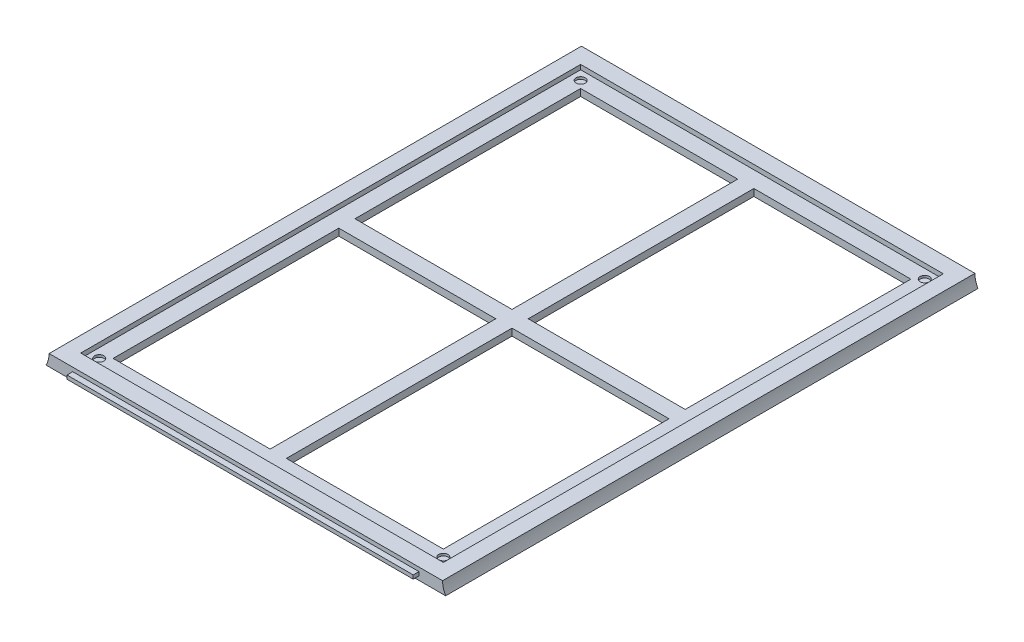
ISO-10303-21;
HEADER;
FILE_DESCRIPTION(('STEP AP214'),'2;1');
FILE_NAME('part.step','',(''),(''),'','','');
FILE_SCHEMA(('AUTOMOTIVE_DESIGN { 1 0 10303 214 1 1 1 1 }'));
ENDSEC;
DATA;
#1=APPLICATION_CONTEXT('core data for automotive mechanical design processes');
#2=APPLICATION_PROTOCOL_DEFINITION('international standard','automotive_design',2000,#1);
#3=PRODUCT_CONTEXT('',#1,'mechanical');
#4=PRODUCT('Part','Part','',(#3));
#5=PRODUCT_RELATED_PRODUCT_CATEGORY('part','',(#4));
#6=PRODUCT_DEFINITION_FORMATION('','',#4);
#7=PRODUCT_DEFINITION_CONTEXT('part definition',#1,'design');
#8=PRODUCT_DEFINITION('design','',#6,#7);
#9=PRODUCT_DEFINITION_SHAPE('','',#8);
#10=(LENGTH_UNIT() NAMED_UNIT(*) SI_UNIT(.MILLI.,.METRE.));
#11=(NAMED_UNIT(*) PLANE_ANGLE_UNIT() SI_UNIT($,.RADIAN.));
#12=(NAMED_UNIT(*) SI_UNIT($,.STERADIAN.) SOLID_ANGLE_UNIT());
#13=UNCERTAINTY_MEASURE_WITH_UNIT(LENGTH_MEASURE(1.E-05),#10,'distance_accuracy_value','');
#14=(GEOMETRIC_REPRESENTATION_CONTEXT(3) GLOBAL_UNCERTAINTY_ASSIGNED_CONTEXT((#13)) GLOBAL_UNIT_ASSIGNED_CONTEXT((#10,
#11,#12)) REPRESENTATION_CONTEXT('',''));
#15=CARTESIAN_POINT('',(0.,0.,0.));
#16=DIRECTION('',(0.,0.,1.));
#17=DIRECTION('',(1.,0.,0.));
#18=AXIS2_PLACEMENT_3D('',#15,#16,#17);
#19=CARTESIAN_POINT('',(0.,2.74600749765697,0.));
#20=DIRECTION('',(0.,-1.,0.));
#21=DIRECTION('',(0.,0.,-1.));
#22=AXIS2_PLACEMENT_3D('',#19,#20,#21);
#23=PLANE('',#22);
#24=CARTESIAN_POINT('',(1.31440487347712,2.74600749765697,219.));
#25=DIRECTION('',(0.,1.,0.));
#26=DIRECTION('',(0.,0.,1.));
#27=AXIS2_PLACEMENT_3D('',#24,#25,#26);
#28=CIRCLE('',#27,2.);
#29=CARTESIAN_POINT('',(1.31440487347712,2.74600749765697,221.));
#30=VERTEX_POINT('',#29);
#31=EDGE_CURVE('E666',#30,#30,#28,.T.);
#32=ORIENTED_EDGE('',*,*,#31,.F.);
#33=EDGE_LOOP('',(#32));
#34=FACE_BOUND('',#33,.T.);
#35=CARTESIAN_POINT('',(-147.365595126523,2.74600749765697,11.));
#36=DIRECTION('',(0.,1.,0.));
#37=DIRECTION('',(0.,0.,1.));
#38=AXIS2_PLACEMENT_3D('',#35,#36,#37);
#39=CIRCLE('',#38,2.);
#40=CARTESIAN_POINT('',(-147.365595126523,2.74600749765697,13.));
#41=VERTEX_POINT('',#40);
#42=EDGE_CURVE('E662',#41,#41,#39,.T.);
#43=ORIENTED_EDGE('',*,*,#42,.F.);
#44=EDGE_LOOP('',(#43));
#45=FACE_BOUND('',#44,.T.);
#46=CARTESIAN_POINT('',(1.31440487347709,2.74600749765697,11.));
#47=DIRECTION('',(0.,1.,0.));
#48=DIRECTION('',(0.,0.,1.));
#49=AXIS2_PLACEMENT_3D('',#46,#47,#48);
#50=CIRCLE('',#49,2.);
#51=CARTESIAN_POINT('',(1.31440487347709,2.74600749765697,13.));
#52=VERTEX_POINT('',#51);
#53=EDGE_CURVE('E657',#52,#52,#50,.T.);
#54=ORIENTED_EDGE('',*,*,#53,.F.);
#55=EDGE_LOOP('',(#54));
#56=FACE_BOUND('',#55,.T.);
#57=CARTESIAN_POINT('',(-147.365595126523,2.74600749765697,219.));
#58=DIRECTION('',(0.,1.,0.));
#59=DIRECTION('',(0.,0.,1.));
#60=AXIS2_PLACEMENT_3D('',#57,#58,#59);
#61=CIRCLE('',#60,2.);
#62=CARTESIAN_POINT('',(-147.365595126523,2.74600749765697,221.));
#63=VERTEX_POINT('',#62);
#64=EDGE_CURVE('E669',#63,#63,#61,.T.);
#65=ORIENTED_EDGE('',*,*,#64,.F.);
#66=EDGE_LOOP('',(#65));
#67=FACE_BOUND('',#66,.T.);
#68=DIRECTION('',(0.,0.,1.));
#69=VECTOR('',#68,1.);
#70=CARTESIAN_POINT('',(5.31440487347708,2.74600749765697,223.));
#71=LINE('',#70,#69);
#72=CARTESIAN_POINT('',(5.3144048734771,2.74600749765697,7.00000000000003));
#73=VERTEX_POINT('',#72);
#74=CARTESIAN_POINT('',(5.31440487347708,2.74600749765697,223.));
#75=VERTEX_POINT('',#74);
#76=EDGE_CURVE('E349',#73,#75,#71,.T.);
#77=ORIENTED_EDGE('',*,*,#76,.F.);
#78=DIRECTION('',(1.,0.,0.));
#79=VECTOR('',#78,1.);
#80=CARTESIAN_POINT('',(-151.365595126523,2.74600749765697,7.00000000000003));
#81=LINE('',#80,#79);
#82=CARTESIAN_POINT('',(-151.365595126523,2.74600749765697,7.00000000000003));
#83=VERTEX_POINT('',#82);
#84=EDGE_CURVE('E357',#83,#73,#81,.T.);
#85=ORIENTED_EDGE('',*,*,#84,.F.);
#86=DIRECTION('',(0.,0.,-1.));
#87=VECTOR('',#86,1.);
#88=CARTESIAN_POINT('',(-151.365595126523,2.74600749765697,223.));
#89=LINE('',#88,#87);
#90=CARTESIAN_POINT('',(-151.365595126523,2.74600749765697,223.));
#91=VERTEX_POINT('',#90);
#92=EDGE_CURVE('E355',#91,#83,#89,.T.);
#93=ORIENTED_EDGE('',*,*,#92,.F.);
#94=DIRECTION('',(-1.,0.,0.));
#95=VECTOR('',#94,1.);
#96=CARTESIAN_POINT('',(-151.365595126523,2.74600749765697,223.));
#97=LINE('',#96,#95);
#98=EDGE_CURVE('E352',#75,#91,#97,.T.);
#99=ORIENTED_EDGE('',*,*,#98,.F.);
#100=EDGE_LOOP('',(#77,#85,#93,#99));
#101=FACE_BOUND('',#100,.T.);
#102=DIRECTION('',(1.,0.,0.));
#103=VECTOR('',#102,1.);
#104=CARTESIAN_POINT('',(-144.365595126523,2.74600749765697,111.5));
#105=LINE('',#104,#103);
#106=CARTESIAN_POINT('',(-144.365595126523,2.74600749765697,111.5));
#107=VERTEX_POINT('',#106);
#108=CARTESIAN_POINT('',(-76.525595126523,2.74600749765697,111.5));
#109=VERTEX_POINT('',#108);
#110=EDGE_CURVE('E297',#107,#109,#105,.T.);
#111=ORIENTED_EDGE('',*,*,#110,.F.);
#112=DIRECTION('',(0.,0.,1.));
#113=VECTOR('',#112,1.);
#114=CARTESIAN_POINT('',(-144.365595126523,2.74600749765697,14.));
#115=LINE('',#114,#113);
#116=CARTESIAN_POINT('',(-144.365595126523,2.74600749765697,14.));
#117=VERTEX_POINT('',#116);
#118=EDGE_CURVE('E281',#117,#107,#115,.T.);
#119=ORIENTED_EDGE('',*,*,#118,.F.);
#120=DIRECTION('',(-1.,0.,0.));
#121=VECTOR('',#120,1.);
#122=CARTESIAN_POINT('',(-144.365595126523,2.74600749765697,14.));
#123=LINE('',#122,#121);
#124=CARTESIAN_POINT('',(-76.525595126523,2.74600749765697,14.));
#125=VERTEX_POINT('',#124);
#126=EDGE_CURVE('E303',#125,#117,#123,.T.);
#127=ORIENTED_EDGE('',*,*,#126,.F.);
#128=DIRECTION('',(0.,0.,-1.));
#129=VECTOR('',#128,1.);
#130=CARTESIAN_POINT('',(-76.525595126523,2.74600749765697,14.));
#131=LINE('',#130,#129);
#132=EDGE_CURVE('E300',#109,#125,#131,.T.);
#133=ORIENTED_EDGE('',*,*,#132,.F.);
#134=EDGE_LOOP('',(#111,#119,#127,#133));
#135=FACE_BOUND('',#134,.T.);
#136=DIRECTION('',(-1.,0.,0.));
#137=VECTOR('',#136,1.);
#138=CARTESIAN_POINT('',(-1.685595126523,2.74600749765697,118.5));
#139=LINE('',#138,#137);
#140=CARTESIAN_POINT('',(-1.685595126523,2.74600749765697,118.5));
#141=VERTEX_POINT('',#140);
#142=CARTESIAN_POINT('',(-69.525595126523,2.74600749765697,118.5));
#143=VERTEX_POINT('',#142);
#144=EDGE_CURVE('E254',#141,#143,#139,.T.);
#145=ORIENTED_EDGE('',*,*,#144,.F.);
#146=DIRECTION('',(0.,0.,-1.));
#147=VECTOR('',#146,1.);
#148=CARTESIAN_POINT('',(-1.685595126523,2.74600749765697,118.5));
#149=LINE('',#148,#147);
#150=CARTESIAN_POINT('',(-1.685595126523,2.74600749765697,216.));
#151=VERTEX_POINT('',#150);
#152=EDGE_CURVE('E232',#151,#141,#149,.T.);
#153=ORIENTED_EDGE('',*,*,#152,.F.);
#154=DIRECTION('',(1.,0.,0.));
#155=VECTOR('',#154,1.);
#156=CARTESIAN_POINT('',(-1.685595126523,2.74600749765697,216.));
#157=LINE('',#156,#155);
#158=CARTESIAN_POINT('',(-69.525595126523,2.74600749765697,216.));
#159=VERTEX_POINT('',#158);
#160=EDGE_CURVE('E242',#159,#151,#157,.T.);
#161=ORIENTED_EDGE('',*,*,#160,.F.);
#162=DIRECTION('',(0.,0.,1.));
#163=VECTOR('',#162,1.);
#164=CARTESIAN_POINT('',(-69.525595126523,2.74600749765697,118.5));
#165=LINE('',#164,#163);
#166=EDGE_CURVE('E248',#143,#159,#165,.T.);
#167=ORIENTED_EDGE('',*,*,#166,.F.);
#168=EDGE_LOOP('',(#145,#153,#161,#167));
#169=FACE_BOUND('',#168,.T.);
#170=DIRECTION('',(1.,0.,0.));
#171=VECTOR('',#170,1.);
#172=CARTESIAN_POINT('',(-144.365595126523,2.74600749765697,216.));
#173=LINE('',#172,#171);
#174=CARTESIAN_POINT('',(-144.365595126523,2.74600749765697,216.));
#175=VERTEX_POINT('',#174);
#176=CARTESIAN_POINT('',(-76.525595126523,2.74600749765697,216.));
#177=VERTEX_POINT('',#176);
#178=EDGE_CURVE('E293',#175,#177,#173,.T.);
#179=ORIENTED_EDGE('',*,*,#178,.F.);
#180=DIRECTION('',(0.,0.,1.));
#181=VECTOR('',#180,1.);
#182=CARTESIAN_POINT('',(-144.365595126523,2.74600749765697,118.5));
#183=LINE('',#182,#181);
#184=CARTESIAN_POINT('',(-144.365595126523,2.74600749765697,118.5));
#185=VERTEX_POINT('',#184);
#186=EDGE_CURVE('E271',#185,#175,#183,.T.);
#187=ORIENTED_EDGE('',*,*,#186,.F.);
#188=DIRECTION('',(-1.,0.,0.));
#189=VECTOR('',#188,1.);
#190=CARTESIAN_POINT('',(-144.365595126523,2.74600749765697,118.5));
#191=LINE('',#190,#189);
#192=CARTESIAN_POINT('',(-76.525595126523,2.74600749765697,118.5));
#193=VERTEX_POINT('',#192);
#194=EDGE_CURVE('E285',#193,#185,#191,.T.);
#195=ORIENTED_EDGE('',*,*,#194,.F.);
#196=DIRECTION('',(0.,0.,-1.));
#197=VECTOR('',#196,1.);
#198=CARTESIAN_POINT('',(-76.525595126523,2.74600749765697,118.5));
#199=LINE('',#198,#197);
#200=EDGE_CURVE('E290',#177,#193,#199,.T.);
#201=ORIENTED_EDGE('',*,*,#200,.F.);
#202=EDGE_LOOP('',(#179,#187,#195,#201));
#203=FACE_BOUND('',#202,.T.);
#204=DIRECTION('',(0.,0.,1.));
#205=VECTOR('',#204,1.);
#206=CARTESIAN_POINT('',(-69.525595126523,2.74600749765697,14.));
#207=LINE('',#206,#205);
#208=CARTESIAN_POINT('',(-69.525595126523,2.74600749765697,14.));
#209=VERTEX_POINT('',#208);
#210=CARTESIAN_POINT('',(-69.525595126523,2.74600749765697,111.5));
#211=VERTEX_POINT('',#210);
#212=EDGE_CURVE('E278',#209,#211,#207,.T.);
#213=ORIENTED_EDGE('',*,*,#212,.F.);
#214=DIRECTION('',(-1.,0.,0.));
#215=VECTOR('',#214,1.);
#216=CARTESIAN_POINT('',(-69.525595126523,2.74600749765697,14.));
#217=LINE('',#216,#215);
#218=CARTESIAN_POINT('',(-1.685595126523,2.74600749765697,14.));
#219=VERTEX_POINT('',#218);
#220=EDGE_CURVE('E264',#219,#209,#217,.T.);
#221=ORIENTED_EDGE('',*,*,#220,.F.);
#222=DIRECTION('',(0.,0.,-1.));
#223=VECTOR('',#222,1.);
#224=CARTESIAN_POINT('',(-1.685595126523,2.74600749765697,14.));
#225=LINE('',#224,#223);
#226=CARTESIAN_POINT('',(-1.685595126523,2.74600749765697,111.5));
#227=VERTEX_POINT('',#226);
#228=EDGE_CURVE('E274',#227,#219,#225,.T.);
#229=ORIENTED_EDGE('',*,*,#228,.F.);
#230=DIRECTION('',(1.,0.,0.));
#231=VECTOR('',#230,1.);
#232=CARTESIAN_POINT('',(-69.525595126523,2.74600749765697,111.5));
#233=LINE('',#232,#231);
#234=EDGE_CURVE('E276',#211,#227,#233,.T.);
#235=ORIENTED_EDGE('',*,*,#234,.F.);
#236=EDGE_LOOP('',(#213,#221,#229,#235));
#237=FACE_BOUND('',#236,.T.);
#238=ADVANCED_FACE('F43',(#34,#45,#56,#67,#101,#135,#169,#203,#237),#23,.F.);
#239=CARTESIAN_POINT('',(-158.025595126523,4.74600749765697,230.));
#240=DIRECTION('',(0.,-1.,0.));
#241=DIRECTION('',(0.,0.,-1.));
#242=AXIS2_PLACEMENT_3D('',#239,#240,#241);
#243=PLANE('',#242);
#244=DIRECTION('',(-1.,0.,0.));
#245=VECTOR('',#244,1.);
#246=CARTESIAN_POINT('',(-158.025595126523,4.74600749765697,0.));
#247=LINE('',#246,#245);
#248=CARTESIAN_POINT('',(11.974404873477,4.74600749765697,0.));
#249=VERTEX_POINT('',#248);
#250=CARTESIAN_POINT('',(-158.025595126523,4.74600749765697,0.));
#251=VERTEX_POINT('',#250);
#252=EDGE_CURVE('E422',#249,#251,#247,.T.);
#253=ORIENTED_EDGE('',*,*,#252,.T.);
#254=DIRECTION('',(0.,0.,-1.));
#255=VECTOR('',#254,1.);
#256=CARTESIAN_POINT('',(-158.025595126523,4.74600749765697,230.));
#257=LINE('',#256,#255);
#258=CARTESIAN_POINT('',(-158.025595126523,4.74600749765697,230.));
#259=VERTEX_POINT('',#258);
#260=EDGE_CURVE('E432',#259,#251,#257,.T.);
#261=ORIENTED_EDGE('',*,*,#260,.F.);
#262=DIRECTION('',(-1.,0.,0.));
#263=VECTOR('',#262,1.);
#264=CARTESIAN_POINT('',(-158.025595126523,4.74600749765697,230.));
#265=LINE('',#264,#263);
#266=CARTESIAN_POINT('',(11.974404873477,4.74600749765697,230.));
#267=VERTEX_POINT('',#266);
#268=EDGE_CURVE('E412',#267,#259,#265,.T.);
#269=ORIENTED_EDGE('',*,*,#268,.F.);
#270=DIRECTION('',(0.,0.,-1.));
#271=VECTOR('',#270,1.);
#272=CARTESIAN_POINT('',(11.974404873477,4.74600749765697,230.));
#273=LINE('',#272,#271);
#274=EDGE_CURVE('E435',#267,#249,#273,.T.);
#275=ORIENTED_EDGE('',*,*,#274,.T.);
#276=EDGE_LOOP('',(#253,#261,#269,#275));
#277=FACE_BOUND('',#276,.T.);
#278=DIRECTION('',(0.,0.,1.));
#279=VECTOR('',#278,1.);
#280=CARTESIAN_POINT('',(5.31440487347708,4.74600749765697,223.));
#281=LINE('',#280,#279);
#282=CARTESIAN_POINT('',(5.31440487347709,4.74600749765697,7.00000000000003));
#283=VERTEX_POINT('',#282);
#284=CARTESIAN_POINT('',(5.31440487347708,4.74600749765697,223.));
#285=VERTEX_POINT('',#284);
#286=EDGE_CURVE('E348',#283,#285,#281,.T.);
#287=ORIENTED_EDGE('',*,*,#286,.T.);
#288=DIRECTION('',(-1.,0.,0.));
#289=VECTOR('',#288,1.);
#290=CARTESIAN_POINT('',(-151.365595126523,4.74600749765697,223.));
#291=LINE('',#290,#289);
#292=CARTESIAN_POINT('',(-151.365595126523,4.74600749765697,223.));
#293=VERTEX_POINT('',#292);
#294=EDGE_CURVE('E362',#285,#293,#291,.T.);
#295=ORIENTED_EDGE('',*,*,#294,.T.);
#296=DIRECTION('',(0.,0.,-1.));
#297=VECTOR('',#296,1.);
#298=CARTESIAN_POINT('',(-151.365595126523,4.74600749765697,223.));
#299=LINE('',#298,#297);
#300=CARTESIAN_POINT('',(-151.365595126523,4.74600749765697,7.00000000000003));
#301=VERTEX_POINT('',#300);
#302=EDGE_CURVE('E365',#293,#301,#299,.T.);
#303=ORIENTED_EDGE('',*,*,#302,.T.);
#304=DIRECTION('',(1.,0.,0.));
#305=VECTOR('',#304,1.);
#306=CARTESIAN_POINT('',(-151.365595126523,4.74600749765697,7.00000000000003));
#307=LINE('',#306,#305);
#308=EDGE_CURVE('E353',#301,#283,#307,.T.);
#309=ORIENTED_EDGE('',*,*,#308,.T.);
#310=EDGE_LOOP('',(#287,#295,#303,#309));
#311=FACE_BOUND('',#310,.T.);
#312=ADVANCED_FACE('F475',(#277,#311),#243,.F.);
#313=CARTESIAN_POINT('',(21.9744048734771,4.746007497657,230.));
#314=DIRECTION('',(0.,0.,1.));
#315=DIRECTION('',(1.,0.,0.));
#316=AXIS2_PLACEMENT_3D('',#313,#314,#315);
#317=PLANE('',#316);
#318=CARTESIAN_POINT('',(21.9744048734771,4.746007497657,230.));
#319=DIRECTION('',(0.,0.,-1.));
#320=DIRECTION('',(1.,0.,0.));
#321=AXIS2_PLACEMENT_3D('',#318,#319,#320);
#322=CIRCLE('',#321,10.0000000000001);
#323=CARTESIAN_POINT('',(13.3141508356327,-0.253992502343023,230.));
#324=VERTEX_POINT('',#323);
#325=EDGE_CURVE('E409',#324,#267,#322,.T.);
#326=ORIENTED_EDGE('',*,*,#325,.T.);
#327=ORIENTED_EDGE('',*,*,#268,.T.);
#328=CARTESIAN_POINT('',(-168.025595126523,4.74600749765706,230.));
#329=DIRECTION('',(0.,0.,-1.));
#330=DIRECTION('',(-1.,0.,0.));
#331=AXIS2_PLACEMENT_3D('',#328,#329,#330);
#332=CIRCLE('',#331,10.0000000000003);
#333=CARTESIAN_POINT('',(-159.365341088679,-0.253992502343008,230.));
#334=VERTEX_POINT('',#333);
#335=EDGE_CURVE('E415',#259,#334,#332,.T.);
#336=ORIENTED_EDGE('',*,*,#335,.T.);
#337=DIRECTION('',(1.,0.,0.));
#338=VECTOR('',#337,1.);
#339=CARTESIAN_POINT('',(13.3141508356327,-0.253992502343023,230.));
#340=LINE('',#339,#338);
#341=EDGE_CURVE('E417',#334,#324,#340,.T.);
#342=ORIENTED_EDGE('',*,*,#341,.T.);
#343=EDGE_LOOP('',(#326,#327,#336,#342));
#344=FACE_BOUND('',#343,.T.);
#345=DIRECTION('',(1.,0.,0.));
#346=VECTOR('',#345,1.);
#347=CARTESIAN_POINT('',(-147.825595126523,1.44600749765696,230.));
#348=LINE('',#347,#346);
#349=CARTESIAN_POINT('',(-147.825595126523,1.44600749765696,230.));
#350=VERTEX_POINT('',#349);
#351=CARTESIAN_POINT('',(1.77440487347696,1.44600749765696,230.));
#352=VERTEX_POINT('',#351);
#353=EDGE_CURVE('E393',#350,#352,#348,.T.);
#354=ORIENTED_EDGE('',*,*,#353,.F.);
#355=DIRECTION('',(0.,-1.,0.));
#356=VECTOR('',#355,1.);
#357=CARTESIAN_POINT('',(-147.825595126523,3.04600749765697,230.));
#358=LINE('',#357,#356);
#359=CARTESIAN_POINT('',(-147.825595126523,3.04600749765697,230.));
#360=VERTEX_POINT('',#359);
#361=EDGE_CURVE('E379',#360,#350,#358,.T.);
#362=ORIENTED_EDGE('',*,*,#361,.F.);
#363=DIRECTION('',(-1.,0.,0.));
#364=VECTOR('',#363,1.);
#365=CARTESIAN_POINT('',(-147.825595126523,3.04600749765697,230.));
#366=LINE('',#365,#364);
#367=CARTESIAN_POINT('',(1.77440487347696,3.04600749765697,230.));
#368=VERTEX_POINT('',#367);
#369=EDGE_CURVE('E384',#368,#360,#366,.T.);
#370=ORIENTED_EDGE('',*,*,#369,.F.);
#371=DIRECTION('',(0.,1.,0.));
#372=VECTOR('',#371,1.);
#373=CARTESIAN_POINT('',(1.77440487347696,3.04600749765697,230.));
#374=LINE('',#373,#372);
#375=EDGE_CURVE('E395',#352,#368,#374,.T.);
#376=ORIENTED_EDGE('',*,*,#375,.F.);
#377=EDGE_LOOP('',(#354,#362,#370,#376));
#378=FACE_BOUND('',#377,.T.);
#379=ADVANCED_FACE('F481',(#344,#378),#317,.T.);
#380=CARTESIAN_POINT('',(21.9744048734771,4.746007497657,0.));
#381=DIRECTION('',(0.,0.,1.));
#382=DIRECTION('',(1.,0.,0.));
#383=AXIS2_PLACEMENT_3D('',#380,#381,#382);
#384=PLANE('',#383);
#385=CARTESIAN_POINT('',(21.9744048734771,4.746007497657,0.));
#386=DIRECTION('',(0.,0.,-1.));
#387=DIRECTION('',(1.,0.,0.));
#388=AXIS2_PLACEMENT_3D('',#385,#386,#387);
#389=CIRCLE('',#388,10.0000000000001);
#390=CARTESIAN_POINT('',(13.3141508356327,-0.253992502343023,0.));
#391=VERTEX_POINT('',#390);
#392=EDGE_CURVE('E408',#391,#249,#389,.T.);
#393=ORIENTED_EDGE('',*,*,#392,.F.);
#394=DIRECTION('',(1.,0.,0.));
#395=VECTOR('',#394,1.);
#396=CARTESIAN_POINT('',(13.3141508356327,-0.253992502343023,0.));
#397=LINE('',#396,#395);
#398=CARTESIAN_POINT('',(-159.365341088679,-0.253992502343008,0.));
#399=VERTEX_POINT('',#398);
#400=EDGE_CURVE('E413',#399,#391,#397,.T.);
#401=ORIENTED_EDGE('',*,*,#400,.F.);
#402=CARTESIAN_POINT('',(-168.025595126523,4.74600749765706,0.));
#403=DIRECTION('',(0.,0.,-1.));
#404=DIRECTION('',(-1.,0.,0.));
#405=AXIS2_PLACEMENT_3D('',#402,#403,#404);
#406=CIRCLE('',#405,10.0000000000003);
#407=EDGE_CURVE('E424',#251,#399,#406,.T.);
#408=ORIENTED_EDGE('',*,*,#407,.F.);
#409=ORIENTED_EDGE('',*,*,#252,.F.);
#410=EDGE_LOOP('',(#393,#401,#408,#409));
#411=FACE_BOUND('',#410,.T.);
#412=ADVANCED_FACE('F527',(#411),#384,.F.);
#413=CARTESIAN_POINT('',(21.9744048734771,4.746007497657,230.));
#414=DIRECTION('',(0.,0.,-1.));
#415=DIRECTION('',(-1.,0.,0.));
#416=AXIS2_PLACEMENT_3D('',#413,#414,#415);
#417=CYLINDRICAL_SURFACE('',#416,10.0000000000001);
#418=ORIENTED_EDGE('',*,*,#392,.T.);
#419=ORIENTED_EDGE('',*,*,#274,.F.);
#420=ORIENTED_EDGE('',*,*,#325,.F.);
#421=DIRECTION('',(0.,0.,-1.));
#422=VECTOR('',#421,1.);
#423=CARTESIAN_POINT('',(13.3141508356327,-0.253992502343023,230.));
#424=LINE('',#423,#422);
#425=EDGE_CURVE('E419',#324,#391,#424,.T.);
#426=ORIENTED_EDGE('',*,*,#425,.T.);
#427=EDGE_LOOP('',(#418,#419,#420,#426));
#428=FACE_BOUND('',#427,.T.);
#429=ADVANCED_FACE('F45',(#428),#417,.F.);
#430=CARTESIAN_POINT('',(-168.025595126523,4.74600749765706,230.));
#431=DIRECTION('',(0.,0.,-1.));
#432=DIRECTION('',(-1.,0.,0.));
#433=AXIS2_PLACEMENT_3D('',#430,#431,#432);
#434=CYLINDRICAL_SURFACE('',#433,10.0000000000003);
#435=ORIENTED_EDGE('',*,*,#407,.T.);
#436=DIRECTION('',(0.,0.,-1.));
#437=VECTOR('',#436,1.);
#438=CARTESIAN_POINT('',(-159.365341088679,-0.253992502343008,230.));
#439=LINE('',#438,#437);
#440=EDGE_CURVE('E429',#334,#399,#439,.T.);
#441=ORIENTED_EDGE('',*,*,#440,.F.);
#442=ORIENTED_EDGE('',*,*,#335,.F.);
#443=ORIENTED_EDGE('',*,*,#260,.T.);
#444=EDGE_LOOP('',(#435,#441,#442,#443));
#445=FACE_BOUND('',#444,.T.);
#446=ADVANCED_FACE('F534',(#445),#434,.F.);
#447=CARTESIAN_POINT('',(13.3141508356327,-0.253992502343023,230.));
#448=DIRECTION('',(0.,1.,0.));
#449=DIRECTION('',(0.,0.,1.));
#450=AXIS2_PLACEMENT_3D('',#447,#448,#449);
#451=PLANE('',#450);
#452=DIRECTION('',(-1.,0.,0.));
#453=VECTOR('',#452,1.);
#454=CARTESIAN_POINT('',(13.3141508356327,-0.253992502343023,14.));
#455=LINE('',#454,#453);
#456=CARTESIAN_POINT('',(-1.685595126523,-0.253992502343023,14.));
#457=VERTEX_POINT('',#456);
#458=CARTESIAN_POINT('',(-69.525595126523,-0.253992502343023,14.));
#459=VERTEX_POINT('',#458);
#460=EDGE_CURVE('E51',#457,#459,#455,.T.);
#461=ORIENTED_EDGE('',*,*,#460,.T.);
#462=DIRECTION('',(0.,0.,1.));
#463=VECTOR('',#462,1.);
#464=CARTESIAN_POINT('',(-69.525595126523,-0.253992502343023,230.));
#465=LINE('',#464,#463);
#466=CARTESIAN_POINT('',(-69.525595126523,-0.253992502343023,111.5));
#467=VERTEX_POINT('',#466);
#468=EDGE_CURVE('E11',#459,#467,#465,.T.);
#469=ORIENTED_EDGE('',*,*,#468,.T.);
#470=DIRECTION('',(1.,0.,0.));
#471=VECTOR('',#470,1.);
#472=CARTESIAN_POINT('',(13.3141508356327,-0.253992502343023,111.5));
#473=LINE('',#472,#471);
#474=CARTESIAN_POINT('',(-1.685595126523,-0.253992502343023,111.5));
#475=VERTEX_POINT('',#474);
#476=EDGE_CURVE('E438',#467,#475,#473,.T.);
#477=ORIENTED_EDGE('',*,*,#476,.T.);
#478=DIRECTION('',(0.,0.,-1.));
#479=VECTOR('',#478,1.);
#480=CARTESIAN_POINT('',(-1.685595126523,-0.253992502343023,230.));
#481=LINE('',#480,#479);
#482=EDGE_CURVE('E441',#475,#457,#481,.T.);
#483=ORIENTED_EDGE('',*,*,#482,.T.);
#484=EDGE_LOOP('',(#461,#469,#477,#483));
#485=FACE_BOUND('',#484,.T.);
#486=DIRECTION('',(-1.,0.,0.));
#487=VECTOR('',#486,1.);
#488=CARTESIAN_POINT('',(13.3141508356327,-0.253992502343023,118.5));
#489=LINE('',#488,#487);
#490=CARTESIAN_POINT('',(-76.525595126523,-0.253992502343023,118.5));
#491=VERTEX_POINT('',#490);
#492=CARTESIAN_POINT('',(-144.365595126523,-0.253992502343023,118.5));
#493=VERTEX_POINT('',#492);
#494=EDGE_CURVE('E342',#491,#493,#489,.T.);
#495=ORIENTED_EDGE('',*,*,#494,.T.);
#496=DIRECTION('',(0.,0.,1.));
#497=VECTOR('',#496,1.);
#498=CARTESIAN_POINT('',(-144.365595126523,-0.253992502343023,230.));
#499=LINE('',#498,#497);
#500=CARTESIAN_POINT('',(-144.365595126523,-0.253992502343023,216.));
#501=VERTEX_POINT('',#500);
#502=EDGE_CURVE('E345',#493,#501,#499,.T.);
#503=ORIENTED_EDGE('',*,*,#502,.T.);
#504=DIRECTION('',(1.,0.,0.));
#505=VECTOR('',#504,1.);
#506=CARTESIAN_POINT('',(13.3141508356327,-0.253992502343023,216.));
#507=LINE('',#506,#505);
#508=CARTESIAN_POINT('',(-76.525595126523,-0.253992502343023,216.));
#509=VERTEX_POINT('',#508);
#510=EDGE_CURVE('E336',#501,#509,#507,.T.);
#511=ORIENTED_EDGE('',*,*,#510,.T.);
#512=DIRECTION('',(0.,0.,-1.));
#513=VECTOR('',#512,1.);
#514=CARTESIAN_POINT('',(-76.525595126523,-0.253992502343023,230.));
#515=LINE('',#514,#513);
#516=EDGE_CURVE('E339',#509,#491,#515,.T.);
#517=ORIENTED_EDGE('',*,*,#516,.T.);
#518=EDGE_LOOP('',(#495,#503,#511,#517));
#519=FACE_BOUND('',#518,.T.);
#520=DIRECTION('',(1.,0.,0.));
#521=VECTOR('',#520,1.);
#522=CARTESIAN_POINT('',(13.3141508356327,-0.253992502343023,216.));
#523=LINE('',#522,#521);
#524=CARTESIAN_POINT('',(-69.525595126523,-0.253992502343023,216.));
#525=VERTEX_POINT('',#524);
#526=CARTESIAN_POINT('',(-1.685595126523,-0.253992502343023,216.));
#527=VERTEX_POINT('',#526);
#528=EDGE_CURVE('E333',#525,#527,#523,.T.);
#529=ORIENTED_EDGE('',*,*,#528,.T.);
#530=DIRECTION('',(0.,0.,-1.));
#531=VECTOR('',#530,1.);
#532=CARTESIAN_POINT('',(-1.685595126523,-0.253992502343023,230.));
#533=LINE('',#532,#531);
#534=CARTESIAN_POINT('',(-1.685595126523,-0.253992502343023,118.5));
#535=VERTEX_POINT('',#534);
#536=EDGE_CURVE('E235',#527,#535,#533,.T.);
#537=ORIENTED_EDGE('',*,*,#536,.T.);
#538=DIRECTION('',(-1.,0.,0.));
#539=VECTOR('',#538,1.);
#540=CARTESIAN_POINT('',(13.3141508356327,-0.253992502343023,118.5));
#541=LINE('',#540,#539);
#542=CARTESIAN_POINT('',(-69.525595126523,-0.253992502343023,118.5));
#543=VERTEX_POINT('',#542);
#544=EDGE_CURVE('E327',#535,#543,#541,.T.);
#545=ORIENTED_EDGE('',*,*,#544,.T.);
#546=DIRECTION('',(0.,0.,1.));
#547=VECTOR('',#546,1.);
#548=CARTESIAN_POINT('',(-69.525595126523,-0.253992502343023,230.));
#549=LINE('',#548,#547);
#550=EDGE_CURVE('E330',#543,#525,#549,.T.);
#551=ORIENTED_EDGE('',*,*,#550,.T.);
#552=EDGE_LOOP('',(#529,#537,#545,#551));
#553=FACE_BOUND('',#552,.T.);
#554=DIRECTION('',(-1.,0.,0.));
#555=VECTOR('',#554,1.);
#556=CARTESIAN_POINT('',(13.3141508356327,-0.253992502343023,14.));
#557=LINE('',#556,#555);
#558=CARTESIAN_POINT('',(-76.525595126523,-0.253992502343023,14.));
#559=VERTEX_POINT('',#558);
#560=CARTESIAN_POINT('',(-144.365595126523,-0.253992502343023,14.));
#561=VERTEX_POINT('',#560);
#562=EDGE_CURVE('E321',#559,#561,#557,.T.);
#563=ORIENTED_EDGE('',*,*,#562,.T.);
#564=DIRECTION('',(0.,0.,1.));
#565=VECTOR('',#564,1.);
#566=CARTESIAN_POINT('',(-144.365595126523,-0.253992502343023,230.));
#567=LINE('',#566,#565);
#568=CARTESIAN_POINT('',(-144.365595126523,-0.253992502343023,111.5));
#569=VERTEX_POINT('',#568);
#570=EDGE_CURVE('E324',#561,#569,#567,.T.);
#571=ORIENTED_EDGE('',*,*,#570,.T.);
#572=DIRECTION('',(1.,0.,0.));
#573=VECTOR('',#572,1.);
#574=CARTESIAN_POINT('',(13.3141508356327,-0.253992502343023,111.5));
#575=LINE('',#574,#573);
#576=CARTESIAN_POINT('',(-76.525595126523,-0.253992502343023,111.5));
#577=VERTEX_POINT('',#576);
#578=EDGE_CURVE('E309',#569,#577,#575,.T.);
#579=ORIENTED_EDGE('',*,*,#578,.T.);
#580=DIRECTION('',(0.,0.,-1.));
#581=VECTOR('',#580,1.);
#582=CARTESIAN_POINT('',(-76.525595126523,-0.253992502343023,230.));
#583=LINE('',#582,#581);
#584=EDGE_CURVE('E318',#577,#559,#583,.T.);
#585=ORIENTED_EDGE('',*,*,#584,.T.);
#586=EDGE_LOOP('',(#563,#571,#579,#585));
#587=FACE_BOUND('',#586,.T.);
#588=ORIENTED_EDGE('',*,*,#400,.T.);
#589=ORIENTED_EDGE('',*,*,#425,.F.);
#590=ORIENTED_EDGE('',*,*,#341,.F.);
#591=ORIENTED_EDGE('',*,*,#440,.T.);
#592=EDGE_LOOP('',(#588,#589,#590,#591));
#593=FACE_BOUND('',#592,.T.);
#594=ADVANCED_FACE('F445',(#485,#519,#553,#587,#593),#451,.F.);
#595=CARTESIAN_POINT('',(-147.825595126523,3.04600749765697,232.48));
#596=DIRECTION('',(1.,0.,0.));
#597=DIRECTION('',(0.,0.,-1.));
#598=AXIS2_PLACEMENT_3D('',#595,#596,#597);
#599=PLANE('',#598);
#600=ORIENTED_EDGE('',*,*,#361,.T.);
#601=DIRECTION('',(0.,0.,-1.));
#602=VECTOR('',#601,1.);
#603=CARTESIAN_POINT('',(-147.825595126523,1.44600749765696,232.48));
#604=LINE('',#603,#602);
#605=CARTESIAN_POINT('',(-147.825595126523,1.44600749765696,232.48));
#606=VERTEX_POINT('',#605);
#607=EDGE_CURVE('E406',#606,#350,#604,.T.);
#608=ORIENTED_EDGE('',*,*,#607,.F.);
#609=DIRECTION('',(0.,-1.,0.));
#610=VECTOR('',#609,1.);
#611=CARTESIAN_POINT('',(-147.825595126523,3.04600749765697,232.48));
#612=LINE('',#611,#610);
#613=CARTESIAN_POINT('',(-147.825595126523,3.04600749765697,232.48));
#614=VERTEX_POINT('',#613);
#615=EDGE_CURVE('E380',#614,#606,#612,.T.);
#616=ORIENTED_EDGE('',*,*,#615,.F.);
#617=DIRECTION('',(0.,0.,-1.));
#618=VECTOR('',#617,1.);
#619=CARTESIAN_POINT('',(-147.825595126523,3.04600749765697,232.48));
#620=LINE('',#619,#618);
#621=EDGE_CURVE('E390',#614,#360,#620,.T.);
#622=ORIENTED_EDGE('',*,*,#621,.T.);
#623=EDGE_LOOP('',(#600,#608,#616,#622));
#624=FACE_BOUND('',#623,.T.);
#625=ADVANCED_FACE('F520',(#624),#599,.F.);
#626=CARTESIAN_POINT('',(-147.825595126523,1.44600749765696,232.48));
#627=DIRECTION('',(0.,1.,0.));
#628=DIRECTION('',(0.,0.,1.));
#629=AXIS2_PLACEMENT_3D('',#626,#627,#628);
#630=PLANE('',#629);
#631=ORIENTED_EDGE('',*,*,#353,.T.);
#632=DIRECTION('',(0.,0.,-1.));
#633=VECTOR('',#632,1.);
#634=CARTESIAN_POINT('',(1.77440487347696,1.44600749765696,232.48));
#635=LINE('',#634,#633);
#636=CARTESIAN_POINT('',(1.77440487347696,1.44600749765696,232.48));
#637=VERTEX_POINT('',#636);
#638=EDGE_CURVE('E403',#637,#352,#635,.T.);
#639=ORIENTED_EDGE('',*,*,#638,.F.);
#640=DIRECTION('',(1.,0.,0.));
#641=VECTOR('',#640,1.);
#642=CARTESIAN_POINT('',(-147.825595126523,1.44600749765696,232.48));
#643=LINE('',#642,#641);
#644=EDGE_CURVE('E383',#606,#637,#643,.T.);
#645=ORIENTED_EDGE('',*,*,#644,.F.);
#646=ORIENTED_EDGE('',*,*,#607,.T.);
#647=EDGE_LOOP('',(#631,#639,#645,#646));
#648=FACE_BOUND('',#647,.T.);
#649=ADVANCED_FACE('F516',(#648),#630,.F.);
#650=CARTESIAN_POINT('',(1.77440487347696,3.04600749765697,232.48));
#651=DIRECTION('',(-1.,0.,0.));
#652=DIRECTION('',(0.,0.,1.));
#653=AXIS2_PLACEMENT_3D('',#650,#651,#652);
#654=PLANE('',#653);
#655=ORIENTED_EDGE('',*,*,#375,.T.);
#656=DIRECTION('',(0.,0.,-1.));
#657=VECTOR('',#656,1.);
#658=CARTESIAN_POINT('',(1.77440487347696,3.04600749765697,232.48));
#659=LINE('',#658,#657);
#660=CARTESIAN_POINT('',(1.77440487347696,3.04600749765697,232.48));
#661=VERTEX_POINT('',#660);
#662=EDGE_CURVE('E401',#661,#368,#659,.T.);
#663=ORIENTED_EDGE('',*,*,#662,.F.);
#664=DIRECTION('',(0.,1.,0.));
#665=VECTOR('',#664,1.);
#666=CARTESIAN_POINT('',(1.77440487347696,3.04600749765697,232.48));
#667=LINE('',#666,#665);
#668=EDGE_CURVE('E386',#637,#661,#667,.T.);
#669=ORIENTED_EDGE('',*,*,#668,.F.);
#670=ORIENTED_EDGE('',*,*,#638,.T.);
#671=EDGE_LOOP('',(#655,#663,#669,#670));
#672=FACE_BOUND('',#671,.T.);
#673=ADVANCED_FACE('F512',(#672),#654,.F.);
#674=CARTESIAN_POINT('',(-147.825595126523,3.04600749765697,232.48));
#675=DIRECTION('',(0.,-1.,0.));
#676=DIRECTION('',(0.,0.,-1.));
#677=AXIS2_PLACEMENT_3D('',#674,#675,#676);
#678=PLANE('',#677);
#679=ORIENTED_EDGE('',*,*,#369,.T.);
#680=ORIENTED_EDGE('',*,*,#621,.F.);
#681=DIRECTION('',(-1.,0.,0.));
#682=VECTOR('',#681,1.);
#683=CARTESIAN_POINT('',(-147.825595126523,3.04600749765697,232.48));
#684=LINE('',#683,#682);
#685=EDGE_CURVE('E388',#661,#614,#684,.T.);
#686=ORIENTED_EDGE('',*,*,#685,.F.);
#687=ORIENTED_EDGE('',*,*,#662,.T.);
#688=EDGE_LOOP('',(#679,#680,#686,#687));
#689=FACE_BOUND('',#688,.T.);
#690=ADVANCED_FACE('F508',(#689),#678,.F.);
#691=CARTESIAN_POINT('',(0.,0.,232.48));
#692=DIRECTION('',(0.,0.,1.));
#693=DIRECTION('',(1.,0.,0.));
#694=AXIS2_PLACEMENT_3D('',#691,#692,#693);
#695=PLANE('',#694);
#696=ORIENTED_EDGE('',*,*,#615,.T.);
#697=ORIENTED_EDGE('',*,*,#644,.T.);
#698=ORIENTED_EDGE('',*,*,#668,.T.);
#699=ORIENTED_EDGE('',*,*,#685,.T.);
#700=EDGE_LOOP('',(#696,#697,#698,#699));
#701=FACE_BOUND('',#700,.T.);
#702=ADVANCED_FACE('F504',(#701),#695,.T.);
#703=CARTESIAN_POINT('',(5.31440487347708,2.74600749765697,223.));
#704=DIRECTION('',(-1.,0.,0.));
#705=DIRECTION('',(0.,0.,1.));
#706=AXIS2_PLACEMENT_3D('',#703,#704,#705);
#707=PLANE('',#706);
#708=ORIENTED_EDGE('',*,*,#286,.F.);
#709=DIRECTION('',(0.,1.,0.));
#710=VECTOR('',#709,1.);
#711=CARTESIAN_POINT('',(5.3144048734771,2.74600749765697,7.00000000000003));
#712=LINE('',#711,#710);
#713=EDGE_CURVE('E359',#73,#283,#712,.T.);
#714=ORIENTED_EDGE('',*,*,#713,.F.);
#715=ORIENTED_EDGE('',*,*,#76,.T.);
#716=DIRECTION('',(0.,1.,0.));
#717=VECTOR('',#716,1.);
#718=CARTESIAN_POINT('',(5.31440487347708,2.74600749765697,223.));
#719=LINE('',#718,#717);
#720=EDGE_CURVE('E376',#75,#285,#719,.T.);
#721=ORIENTED_EDGE('',*,*,#720,.T.);
#722=EDGE_LOOP('',(#708,#714,#715,#721));
#723=FACE_BOUND('',#722,.T.);
#724=ADVANCED_FACE('F500',(#723),#707,.T.);
#725=CARTESIAN_POINT('',(-151.365595126523,2.74600749765697,223.));
#726=DIRECTION('',(0.,0.,-1.));
#727=DIRECTION('',(-1.,0.,0.));
#728=AXIS2_PLACEMENT_3D('',#725,#726,#727);
#729=PLANE('',#728);
#730=ORIENTED_EDGE('',*,*,#294,.F.);
#731=ORIENTED_EDGE('',*,*,#720,.F.);
#732=ORIENTED_EDGE('',*,*,#98,.T.);
#733=DIRECTION('',(0.,1.,0.));
#734=VECTOR('',#733,1.);
#735=CARTESIAN_POINT('',(-151.365595126523,2.74600749765697,223.));
#736=LINE('',#735,#734);
#737=EDGE_CURVE('E374',#91,#293,#736,.T.);
#738=ORIENTED_EDGE('',*,*,#737,.T.);
#739=EDGE_LOOP('',(#730,#731,#732,#738));
#740=FACE_BOUND('',#739,.T.);
#741=ADVANCED_FACE('F496',(#740),#729,.T.);
#742=CARTESIAN_POINT('',(-151.365595126523,2.74600749765697,223.));
#743=DIRECTION('',(1.,0.,0.));
#744=DIRECTION('',(0.,0.,-1.));
#745=AXIS2_PLACEMENT_3D('',#742,#743,#744);
#746=PLANE('',#745);
#747=ORIENTED_EDGE('',*,*,#302,.F.);
#748=ORIENTED_EDGE('',*,*,#737,.F.);
#749=ORIENTED_EDGE('',*,*,#92,.T.);
#750=DIRECTION('',(0.,1.,0.));
#751=VECTOR('',#750,1.);
#752=CARTESIAN_POINT('',(-151.365595126523,2.74600749765697,7.00000000000003));
#753=LINE('',#752,#751);
#754=EDGE_CURVE('E372',#83,#301,#753,.T.);
#755=ORIENTED_EDGE('',*,*,#754,.T.);
#756=EDGE_LOOP('',(#747,#748,#749,#755));
#757=FACE_BOUND('',#756,.T.);
#758=ADVANCED_FACE('F492',(#757),#746,.T.);
#759=CARTESIAN_POINT('',(-151.365595126523,2.74600749765697,7.00000000000003));
#760=DIRECTION('',(0.,0.,1.));
#761=DIRECTION('',(1.,0.,0.));
#762=AXIS2_PLACEMENT_3D('',#759,#760,#761);
#763=PLANE('',#762);
#764=ORIENTED_EDGE('',*,*,#308,.F.);
#765=ORIENTED_EDGE('',*,*,#754,.F.);
#766=ORIENTED_EDGE('',*,*,#84,.T.);
#767=ORIENTED_EDGE('',*,*,#713,.T.);
#768=EDGE_LOOP('',(#764,#765,#766,#767));
#769=FACE_BOUND('',#768,.T.);
#770=ADVANCED_FACE('F489',(#769),#763,.T.);
#771=CARTESIAN_POINT('',(-144.365595126523,-17.253992502343,14.));
#772=DIRECTION('',(-1.,0.,0.));
#773=DIRECTION('',(0.,0.,1.));
#774=AXIS2_PLACEMENT_3D('',#771,#772,#773);
#775=PLANE('',#774);
#776=DIRECTION('',(0.,1.,0.));
#777=VECTOR('',#776,1.);
#778=CARTESIAN_POINT('',(-144.365595126523,-17.253992502343,14.));
#779=LINE('',#778,#777);
#780=EDGE_CURVE('E307',#561,#117,#779,.T.);
#781=ORIENTED_EDGE('',*,*,#780,.T.);
#782=ORIENTED_EDGE('',*,*,#118,.T.);
#783=DIRECTION('',(0.,1.,0.));
#784=VECTOR('',#783,1.);
#785=CARTESIAN_POINT('',(-144.365595126523,-17.253992502343,111.5));
#786=LINE('',#785,#784);
#787=EDGE_CURVE('E306',#569,#107,#786,.T.);
#788=ORIENTED_EDGE('',*,*,#787,.F.);
#789=ORIENTED_EDGE('',*,*,#570,.F.);
#790=EDGE_LOOP('',(#781,#782,#788,#789));
#791=FACE_BOUND('',#790,.T.);
#792=ADVANCED_FACE('F487',(#791),#775,.F.);
#793=CARTESIAN_POINT('',(-144.365595126523,-17.253992502343,14.));
#794=DIRECTION('',(0.,0.,-1.));
#795=DIRECTION('',(-1.,0.,0.));
#796=AXIS2_PLACEMENT_3D('',#793,#794,#795);
#797=PLANE('',#796);
#798=DIRECTION('',(0.,1.,0.));
#799=VECTOR('',#798,1.);
#800=CARTESIAN_POINT('',(-76.525595126523,-17.253992502343,14.));
#801=LINE('',#800,#799);
#802=EDGE_CURVE('E310',#559,#125,#801,.T.);
#803=ORIENTED_EDGE('',*,*,#802,.T.);
#804=ORIENTED_EDGE('',*,*,#126,.T.);
#805=ORIENTED_EDGE('',*,*,#780,.F.);
#806=ORIENTED_EDGE('',*,*,#562,.F.);
#807=EDGE_LOOP('',(#803,#804,#805,#806));
#808=FACE_BOUND('',#807,.T.);
#809=ADVANCED_FACE('F578',(#808),#797,.F.);
#810=CARTESIAN_POINT('',(-76.525595126523,-17.253992502343,14.));
#811=DIRECTION('',(1.,0.,0.));
#812=DIRECTION('',(0.,0.,-1.));
#813=AXIS2_PLACEMENT_3D('',#810,#811,#812);
#814=PLANE('',#813);
#815=DIRECTION('',(0.,1.,0.));
#816=VECTOR('',#815,1.);
#817=CARTESIAN_POINT('',(-76.525595126523,-17.253992502343,111.5));
#818=LINE('',#817,#816);
#819=EDGE_CURVE('E312',#577,#109,#818,.T.);
#820=ORIENTED_EDGE('',*,*,#819,.T.);
#821=ORIENTED_EDGE('',*,*,#132,.T.);
#822=ORIENTED_EDGE('',*,*,#802,.F.);
#823=ORIENTED_EDGE('',*,*,#584,.F.);
#824=EDGE_LOOP('',(#820,#821,#822,#823));
#825=FACE_BOUND('',#824,.T.);
#826=ADVANCED_FACE('F580',(#825),#814,.F.);
#827=CARTESIAN_POINT('',(-144.365595126523,-17.253992502343,111.5));
#828=DIRECTION('',(0.,0.,1.));
#829=DIRECTION('',(1.,0.,0.));
#830=AXIS2_PLACEMENT_3D('',#827,#828,#829);
#831=PLANE('',#830);
#832=ORIENTED_EDGE('',*,*,#787,.T.);
#833=ORIENTED_EDGE('',*,*,#110,.T.);
#834=ORIENTED_EDGE('',*,*,#819,.F.);
#835=ORIENTED_EDGE('',*,*,#578,.F.);
#836=EDGE_LOOP('',(#832,#833,#834,#835));
#837=FACE_BOUND('',#836,.T.);
#838=ADVANCED_FACE('F570',(#837),#831,.F.);
#839=CARTESIAN_POINT('',(-1.685595126523,-17.253992502343,118.5));
#840=DIRECTION('',(1.,0.,0.));
#841=DIRECTION('',(0.,0.,-1.));
#842=AXIS2_PLACEMENT_3D('',#839,#840,#841);
#843=PLANE('',#842);
#844=DIRECTION('',(0.,1.,0.));
#845=VECTOR('',#844,1.);
#846=CARTESIAN_POINT('',(-1.685595126523,-17.253992502343,216.));
#847=LINE('',#846,#845);
#848=EDGE_CURVE('E227',#527,#151,#847,.T.);
#849=ORIENTED_EDGE('',*,*,#848,.T.);
#850=ORIENTED_EDGE('',*,*,#152,.T.);
#851=DIRECTION('',(0.,1.,0.));
#852=VECTOR('',#851,1.);
#853=CARTESIAN_POINT('',(-1.685595126523,-17.253992502343,118.5));
#854=LINE('',#853,#852);
#855=EDGE_CURVE('E249',#535,#141,#854,.T.);
#856=ORIENTED_EDGE('',*,*,#855,.F.);
#857=ORIENTED_EDGE('',*,*,#536,.F.);
#858=EDGE_LOOP('',(#849,#850,#856,#857));
#859=FACE_BOUND('',#858,.T.);
#860=ADVANCED_FACE('F229',(#859),#843,.F.);
#861=CARTESIAN_POINT('',(-1.685595126523,-17.253992502343,216.));
#862=DIRECTION('',(0.,0.,1.));
#863=DIRECTION('',(1.,0.,0.));
#864=AXIS2_PLACEMENT_3D('',#861,#862,#863);
#865=PLANE('',#864);
#866=DIRECTION('',(0.,1.,0.));
#867=VECTOR('',#866,1.);
#868=CARTESIAN_POINT('',(-69.525595126523,-17.253992502343,216.));
#869=LINE('',#868,#867);
#870=EDGE_CURVE('E238',#525,#159,#869,.T.);
#871=ORIENTED_EDGE('',*,*,#870,.T.);
#872=ORIENTED_EDGE('',*,*,#160,.T.);
#873=ORIENTED_EDGE('',*,*,#848,.F.);
#874=ORIENTED_EDGE('',*,*,#528,.F.);
#875=EDGE_LOOP('',(#871,#872,#873,#874));
#876=FACE_BOUND('',#875,.T.);
#877=ADVANCED_FACE('F243',(#876),#865,.F.);
#878=CARTESIAN_POINT('',(-69.525595126523,-17.253992502343,118.5));
#879=DIRECTION('',(-1.,0.,0.));
#880=DIRECTION('',(0.,0.,1.));
#881=AXIS2_PLACEMENT_3D('',#878,#879,#880);
#882=PLANE('',#881);
#883=DIRECTION('',(0.,1.,0.));
#884=VECTOR('',#883,1.);
#885=CARTESIAN_POINT('',(-69.525595126523,-17.253992502343,118.5));
#886=LINE('',#885,#884);
#887=EDGE_CURVE('E680',#543,#143,#886,.T.);
#888=ORIENTED_EDGE('',*,*,#887,.T.);
#889=ORIENTED_EDGE('',*,*,#166,.T.);
#890=ORIENTED_EDGE('',*,*,#870,.F.);
#891=ORIENTED_EDGE('',*,*,#550,.F.);
#892=EDGE_LOOP('',(#888,#889,#890,#891));
#893=FACE_BOUND('',#892,.T.);
#894=ADVANCED_FACE('F614',(#893),#882,.F.);
#895=CARTESIAN_POINT('',(-1.685595126523,-17.253992502343,118.5));
#896=DIRECTION('',(0.,0.,-1.));
#897=DIRECTION('',(-1.,0.,0.));
#898=AXIS2_PLACEMENT_3D('',#895,#896,#897);
#899=PLANE('',#898);
#900=ORIENTED_EDGE('',*,*,#855,.T.);
#901=ORIENTED_EDGE('',*,*,#144,.T.);
#902=ORIENTED_EDGE('',*,*,#887,.F.);
#903=ORIENTED_EDGE('',*,*,#544,.F.);
#904=EDGE_LOOP('',(#900,#901,#902,#903));
#905=FACE_BOUND('',#904,.T.);
#906=ADVANCED_FACE('F603',(#905),#899,.F.);
#907=CARTESIAN_POINT('',(-144.365595126523,-17.253992502343,118.5));
#908=DIRECTION('',(-1.,0.,0.));
#909=DIRECTION('',(0.,0.,1.));
#910=AXIS2_PLACEMENT_3D('',#907,#908,#909);
#911=PLANE('',#910);
#912=DIRECTION('',(0.,1.,0.));
#913=VECTOR('',#912,1.);
#914=CARTESIAN_POINT('',(-144.365595126523,-17.253992502343,118.5));
#915=LINE('',#914,#913);
#916=EDGE_CURVE('E255',#493,#185,#915,.T.);
#917=ORIENTED_EDGE('',*,*,#916,.T.);
#918=ORIENTED_EDGE('',*,*,#186,.T.);
#919=DIRECTION('',(0.,1.,0.));
#920=VECTOR('',#919,1.);
#921=CARTESIAN_POINT('',(-144.365595126523,-17.253992502343,216.));
#922=LINE('',#921,#920);
#923=EDGE_CURVE('E282',#501,#175,#922,.T.);
#924=ORIENTED_EDGE('',*,*,#923,.F.);
#925=ORIENTED_EDGE('',*,*,#502,.F.);
#926=EDGE_LOOP('',(#917,#918,#924,#925));
#927=FACE_BOUND('',#926,.T.);
#928=ADVANCED_FACE('F593',(#927),#911,.F.);
#929=CARTESIAN_POINT('',(-144.365595126523,-17.253992502343,118.5));
#930=DIRECTION('',(0.,0.,-1.));
#931=DIRECTION('',(-1.,0.,0.));
#932=AXIS2_PLACEMENT_3D('',#929,#930,#931);
#933=PLANE('',#932);
#934=DIRECTION('',(0.,1.,0.));
#935=VECTOR('',#934,1.);
#936=CARTESIAN_POINT('',(-76.525595126523,-17.253992502343,118.5));
#937=LINE('',#936,#935);
#938=EDGE_CURVE('E257',#491,#193,#937,.T.);
#939=ORIENTED_EDGE('',*,*,#938,.T.);
#940=ORIENTED_EDGE('',*,*,#194,.T.);
#941=ORIENTED_EDGE('',*,*,#916,.F.);
#942=ORIENTED_EDGE('',*,*,#494,.F.);
#943=EDGE_LOOP('',(#939,#940,#941,#942));
#944=FACE_BOUND('',#943,.T.);
#945=ADVANCED_FACE('F589',(#944),#933,.F.);
#946=CARTESIAN_POINT('',(-76.525595126523,-17.253992502343,118.5));
#947=DIRECTION('',(1.,0.,0.));
#948=DIRECTION('',(0.,0.,-1.));
#949=AXIS2_PLACEMENT_3D('',#946,#947,#948);
#950=PLANE('',#949);
#951=DIRECTION('',(0.,1.,0.));
#952=VECTOR('',#951,1.);
#953=CARTESIAN_POINT('',(-76.525595126523,-17.253992502343,216.));
#954=LINE('',#953,#952);
#955=EDGE_CURVE('E66',#509,#177,#954,.T.);
#956=ORIENTED_EDGE('',*,*,#955,.T.);
#957=ORIENTED_EDGE('',*,*,#200,.T.);
#958=ORIENTED_EDGE('',*,*,#938,.F.);
#959=ORIENTED_EDGE('',*,*,#516,.F.);
#960=EDGE_LOOP('',(#956,#957,#958,#959));
#961=FACE_BOUND('',#960,.T.);
#962=ADVANCED_FACE('F592',(#961),#950,.F.);
#963=CARTESIAN_POINT('',(-144.365595126523,-17.253992502343,216.));
#964=DIRECTION('',(0.,0.,1.));
#965=DIRECTION('',(1.,0.,0.));
#966=AXIS2_PLACEMENT_3D('',#963,#964,#965);
#967=PLANE('',#966);
#968=ORIENTED_EDGE('',*,*,#923,.T.);
#969=ORIENTED_EDGE('',*,*,#178,.T.);
#970=ORIENTED_EDGE('',*,*,#955,.F.);
#971=ORIENTED_EDGE('',*,*,#510,.F.);
#972=EDGE_LOOP('',(#968,#969,#970,#971));
#973=FACE_BOUND('',#972,.T.);
#974=ADVANCED_FACE('F597',(#973),#967,.F.);
#975=CARTESIAN_POINT('',(-69.525595126523,-17.253992502343,14.));
#976=DIRECTION('',(-1.,0.,0.));
#977=DIRECTION('',(0.,0.,1.));
#978=AXIS2_PLACEMENT_3D('',#975,#976,#977);
#979=PLANE('',#978);
#980=DIRECTION('',(0.,1.,0.));
#981=VECTOR('',#980,1.);
#982=CARTESIAN_POINT('',(-69.525595126523,-17.253992502343,14.));
#983=LINE('',#982,#981);
#984=EDGE_CURVE('E269',#459,#209,#983,.T.);
#985=ORIENTED_EDGE('',*,*,#984,.T.);
#986=ORIENTED_EDGE('',*,*,#212,.T.);
#987=DIRECTION('',(0.,1.,0.));
#988=VECTOR('',#987,1.);
#989=CARTESIAN_POINT('',(-69.525595126523,-17.253992502343,111.5));
#990=LINE('',#989,#988);
#991=EDGE_CURVE('E262',#467,#211,#990,.T.);
#992=ORIENTED_EDGE('',*,*,#991,.F.);
#993=ORIENTED_EDGE('',*,*,#468,.F.);
#994=EDGE_LOOP('',(#985,#986,#992,#993));
#995=FACE_BOUND('',#994,.T.);
#996=ADVANCED_FACE('F460',(#995),#979,.F.);
#997=CARTESIAN_POINT('',(-69.525595126523,-17.253992502343,14.));
#998=DIRECTION('',(0.,0.,-1.));
#999=DIRECTION('',(-1.,0.,0.));
#1000=AXIS2_PLACEMENT_3D('',#997,#998,#999);
#1001=PLANE('',#1000);
#1002=DIRECTION('',(0.,1.,0.));
#1003=VECTOR('',#1002,1.);
#1004=CARTESIAN_POINT('',(-1.685595126523,-17.253992502343,14.));
#1005=LINE('',#1004,#1003);
#1006=EDGE_CURVE('E266',#457,#219,#1005,.T.);
#1007=ORIENTED_EDGE('',*,*,#1006,.T.);
#1008=ORIENTED_EDGE('',*,*,#220,.T.);
#1009=ORIENTED_EDGE('',*,*,#984,.F.);
#1010=ORIENTED_EDGE('',*,*,#460,.F.);
#1011=EDGE_LOOP('',(#1007,#1008,#1009,#1010));
#1012=FACE_BOUND('',#1011,.T.);
#1013=ADVANCED_FACE('F450',(#1012),#1001,.F.);
#1014=CARTESIAN_POINT('',(-1.685595126523,-17.253992502343,14.));
#1015=DIRECTION('',(1.,0.,0.));
#1016=DIRECTION('',(0.,0.,-1.));
#1017=AXIS2_PLACEMENT_3D('',#1014,#1015,#1016);
#1018=PLANE('',#1017);
#1019=DIRECTION('',(0.,1.,0.));
#1020=VECTOR('',#1019,1.);
#1021=CARTESIAN_POINT('',(-1.685595126523,-17.253992502343,111.5));
#1022=LINE('',#1021,#1020);
#1023=EDGE_CURVE('E58',#475,#227,#1022,.T.);
#1024=ORIENTED_EDGE('',*,*,#1023,.T.);
#1025=ORIENTED_EDGE('',*,*,#228,.T.);
#1026=ORIENTED_EDGE('',*,*,#1006,.F.);
#1027=ORIENTED_EDGE('',*,*,#482,.F.);
#1028=EDGE_LOOP('',(#1024,#1025,#1026,#1027));
#1029=FACE_BOUND('',#1028,.T.);
#1030=ADVANCED_FACE('F453',(#1029),#1018,.F.);
#1031=CARTESIAN_POINT('',(-69.525595126523,-17.253992502343,111.5));
#1032=DIRECTION('',(0.,0.,1.));
#1033=DIRECTION('',(1.,0.,0.));
#1034=AXIS2_PLACEMENT_3D('',#1031,#1032,#1033);
#1035=PLANE('',#1034);
#1036=ORIENTED_EDGE('',*,*,#991,.T.);
#1037=ORIENTED_EDGE('',*,*,#234,.T.);
#1038=ORIENTED_EDGE('',*,*,#1023,.F.);
#1039=ORIENTED_EDGE('',*,*,#476,.F.);
#1040=EDGE_LOOP('',(#1036,#1037,#1038,#1039));
#1041=FACE_BOUND('',#1040,.T.);
#1042=ADVANCED_FACE('F461',(#1041),#1035,.F.);
#1043=CARTESIAN_POINT('',(-147.365595126523,1.74600749765697,219.));
#1044=DIRECTION('',(0.,1.,0.));
#1045=DIRECTION('',(0.,0.,1.));
#1046=AXIS2_PLACEMENT_3D('',#1043,#1044,#1045);
#1047=CYLINDRICAL_SURFACE('',#1046,2.);
#1048=CARTESIAN_POINT('',(-147.365595126523,1.74600749765697,219.));
#1049=DIRECTION('',(0.,1.,0.));
#1050=DIRECTION('',(0.,0.,1.));
#1051=AXIS2_PLACEMENT_3D('',#1048,#1049,#1050);
#1052=CIRCLE('',#1051,2.);
#1053=CARTESIAN_POINT('',(-147.365595126523,1.74600749765697,221.));
#1054=VERTEX_POINT('',#1053);
#1055=EDGE_CURVE('E239',#1054,#1054,#1052,.T.);
#1056=ORIENTED_EDGE('',*,*,#1055,.F.);
#1057=EDGE_LOOP('',(#1056));
#1058=FACE_BOUND('',#1057,.T.);
#1059=ORIENTED_EDGE('',*,*,#64,.T.);
#1060=EDGE_LOOP('',(#1059));
#1061=FACE_BOUND('',#1060,.T.);
#1062=ADVANCED_FACE('F463',(#1058,#1061),#1047,.F.);
#1063=CARTESIAN_POINT('',(-147.365595126523,1.74600749765697,219.));
#1064=DIRECTION('',(0.,1.,0.));
#1065=DIRECTION('',(0.,0.,1.));
#1066=AXIS2_PLACEMENT_3D('',#1063,#1064,#1065);
#1067=PLANE('',#1066);
#1068=ORIENTED_EDGE('',*,*,#1055,.T.);
#1069=EDGE_LOOP('',(#1068));
#1070=FACE_BOUND('',#1069,.T.);
#1071=ADVANCED_FACE('F470',(#1070),#1067,.T.);
#1072=CARTESIAN_POINT('',(1.31440487347709,1.74600749765697,11.));
#1073=DIRECTION('',(0.,1.,0.));
#1074=DIRECTION('',(0.,0.,1.));
#1075=AXIS2_PLACEMENT_3D('',#1072,#1073,#1074);
#1076=CYLINDRICAL_SURFACE('',#1075,2.);
#1077=CARTESIAN_POINT('',(1.31440487347709,1.74600749765697,11.));
#1078=DIRECTION('',(0.,1.,0.));
#1079=DIRECTION('',(0.,0.,1.));
#1080=AXIS2_PLACEMENT_3D('',#1077,#1078,#1079);
#1081=CIRCLE('',#1080,2.);
#1082=CARTESIAN_POINT('',(1.31440487347709,1.74600749765697,13.));
#1083=VERTEX_POINT('',#1082);
#1084=EDGE_CURVE('E654',#1083,#1083,#1081,.T.);
#1085=ORIENTED_EDGE('',*,*,#1084,.F.);
#1086=EDGE_LOOP('',(#1085));
#1087=FACE_BOUND('',#1086,.T.);
#1088=ORIENTED_EDGE('',*,*,#53,.T.);
#1089=EDGE_LOOP('',(#1088));
#1090=FACE_BOUND('',#1089,.T.);
#1091=ADVANCED_FACE('F625',(#1087,#1090),#1076,.F.);
#1092=CARTESIAN_POINT('',(1.31440487347709,1.74600749765697,11.));
#1093=DIRECTION('',(0.,1.,0.));
#1094=DIRECTION('',(0.,0.,1.));
#1095=AXIS2_PLACEMENT_3D('',#1092,#1093,#1094);
#1096=PLANE('',#1095);
#1097=ORIENTED_EDGE('',*,*,#1084,.T.);
#1098=EDGE_LOOP('',(#1097));
#1099=FACE_BOUND('',#1098,.T.);
#1100=ADVANCED_FACE('F635',(#1099),#1096,.T.);
#1101=CARTESIAN_POINT('',(-147.365595126523,1.74600749765697,11.));
#1102=DIRECTION('',(0.,1.,0.));
#1103=DIRECTION('',(0.,0.,1.));
#1104=AXIS2_PLACEMENT_3D('',#1101,#1102,#1103);
#1105=CYLINDRICAL_SURFACE('',#1104,2.);
#1106=CARTESIAN_POINT('',(-147.365595126523,1.74600749765697,11.));
#1107=DIRECTION('',(0.,1.,0.));
#1108=DIRECTION('',(0.,0.,1.));
#1109=AXIS2_PLACEMENT_3D('',#1106,#1107,#1108);
#1110=CIRCLE('',#1109,2.);
#1111=CARTESIAN_POINT('',(-147.365595126523,1.74600749765697,13.));
#1112=VERTEX_POINT('',#1111);
#1113=EDGE_CURVE('E659',#1112,#1112,#1110,.T.);
#1114=ORIENTED_EDGE('',*,*,#1113,.F.);
#1115=EDGE_LOOP('',(#1114));
#1116=FACE_BOUND('',#1115,.T.);
#1117=ORIENTED_EDGE('',*,*,#42,.T.);
#1118=EDGE_LOOP('',(#1117));
#1119=FACE_BOUND('',#1118,.T.);
#1120=ADVANCED_FACE('F631',(#1116,#1119),#1105,.F.);
#1121=CARTESIAN_POINT('',(-147.365595126523,1.74600749765697,11.));
#1122=DIRECTION('',(0.,1.,0.));
#1123=DIRECTION('',(0.,0.,1.));
#1124=AXIS2_PLACEMENT_3D('',#1121,#1122,#1123);
#1125=PLANE('',#1124);
#1126=ORIENTED_EDGE('',*,*,#1113,.T.);
#1127=EDGE_LOOP('',(#1126));
#1128=FACE_BOUND('',#1127,.T.);
#1129=ADVANCED_FACE('F627',(#1128),#1125,.T.);
#1130=CARTESIAN_POINT('',(1.31440487347712,1.74600749765697,219.));
#1131=DIRECTION('',(0.,1.,0.));
#1132=DIRECTION('',(0.,0.,1.));
#1133=AXIS2_PLACEMENT_3D('',#1130,#1131,#1132);
#1134=CYLINDRICAL_SURFACE('',#1133,2.);
#1135=CARTESIAN_POINT('',(1.31440487347712,1.74600749765697,219.));
#1136=DIRECTION('',(0.,1.,0.));
#1137=DIRECTION('',(0.,0.,1.));
#1138=AXIS2_PLACEMENT_3D('',#1135,#1136,#1137);
#1139=CIRCLE('',#1138,2.);
#1140=CARTESIAN_POINT('',(1.31440487347712,1.74600749765697,221.));
#1141=VERTEX_POINT('',#1140);
#1142=EDGE_CURVE('E670',#1141,#1141,#1139,.T.);
#1143=ORIENTED_EDGE('',*,*,#1142,.F.);
#1144=EDGE_LOOP('',(#1143));
#1145=FACE_BOUND('',#1144,.T.);
#1146=ORIENTED_EDGE('',*,*,#31,.T.);
#1147=EDGE_LOOP('',(#1146));
#1148=FACE_BOUND('',#1147,.T.);
#1149=ADVANCED_FACE('F630',(#1145,#1148),#1134,.F.);
#1150=CARTESIAN_POINT('',(1.31440487347712,1.74600749765697,219.));
#1151=DIRECTION('',(0.,1.,0.));
#1152=DIRECTION('',(0.,0.,1.));
#1153=AXIS2_PLACEMENT_3D('',#1150,#1151,#1152);
#1154=PLANE('',#1153);
#1155=ORIENTED_EDGE('',*,*,#1142,.T.);
#1156=EDGE_LOOP('',(#1155));
#1157=FACE_BOUND('',#1156,.T.);
#1158=ADVANCED_FACE('F637',(#1157),#1154,.T.);
#1159=CLOSED_SHELL('',(#238,#312,#379,#412,#429,#446,#594,#625,#649,#673,#690,#702,#724,#741,
#758,#770,#792,#809,#826,#838,#860,#877,#894,#906,#928,#945,#962,#974,#996,#1013,#1030,#1042,
#1062,#1071,#1091,#1100,#1120,#1129,#1149,#1158));
#1160=MANIFOLD_SOLID_BREP('B2',#1159);
#1161=ADVANCED_BREP_SHAPE_REPRESENTATION('',(#18,#1160),#14);
#1162=SHAPE_DEFINITION_REPRESENTATION(#9,#1161);
ENDSEC;
END-ISO-10303-21;
